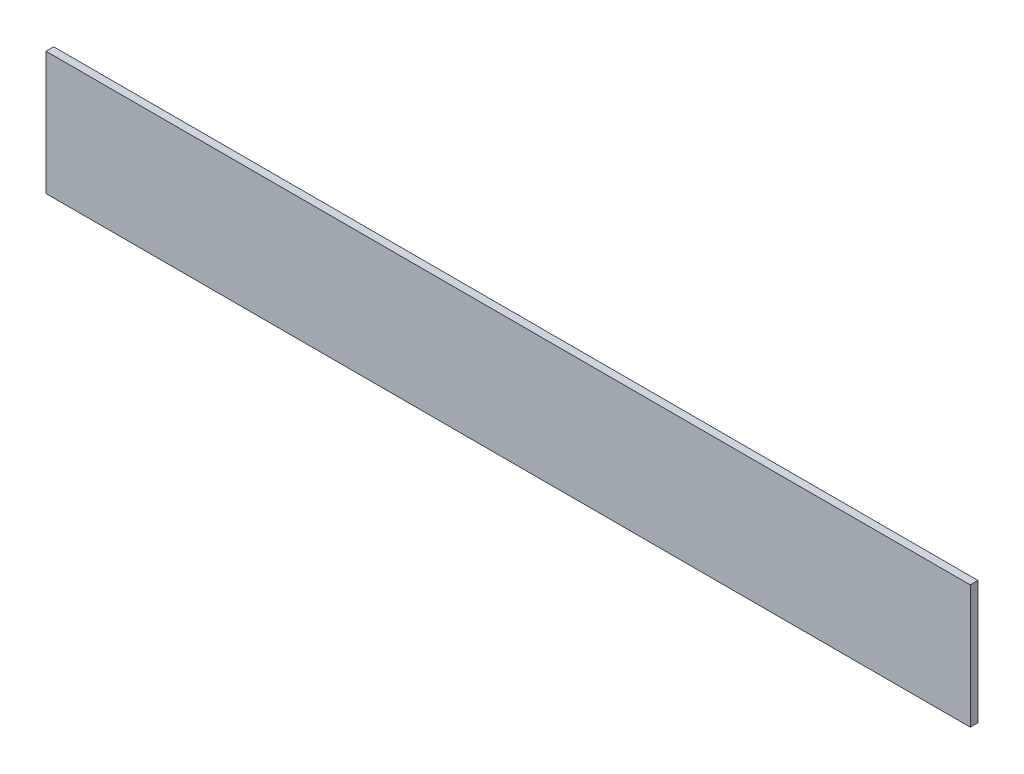
ISO-10303-21;
HEADER;
FILE_DESCRIPTION(('STEP AP214'),'2;1');
FILE_NAME('part.step','',(''),(''),'','','');
FILE_SCHEMA(('AUTOMOTIVE_DESIGN { 1 0 10303 214 1 1 1 1 }'));
ENDSEC;
DATA;
#1=APPLICATION_CONTEXT('core data for automotive mechanical design processes');
#2=APPLICATION_PROTOCOL_DEFINITION('international standard','automotive_design',2000,#1);
#3=PRODUCT_CONTEXT('',#1,'mechanical');
#4=PRODUCT('Part','Part','',(#3));
#5=PRODUCT_RELATED_PRODUCT_CATEGORY('part','',(#4));
#6=PRODUCT_DEFINITION_FORMATION('','',#4);
#7=PRODUCT_DEFINITION_CONTEXT('part definition',#1,'design');
#8=PRODUCT_DEFINITION('design','',#6,#7);
#9=PRODUCT_DEFINITION_SHAPE('','',#8);
#10=(LENGTH_UNIT() NAMED_UNIT(*) SI_UNIT(.MILLI.,.METRE.));
#11=(NAMED_UNIT(*) PLANE_ANGLE_UNIT() SI_UNIT($,.RADIAN.));
#12=(NAMED_UNIT(*) SI_UNIT($,.STERADIAN.) SOLID_ANGLE_UNIT());
#13=UNCERTAINTY_MEASURE_WITH_UNIT(LENGTH_MEASURE(1.E-05),#10,'distance_accuracy_value','');
#14=(GEOMETRIC_REPRESENTATION_CONTEXT(3) GLOBAL_UNCERTAINTY_ASSIGNED_CONTEXT((#13)) GLOBAL_UNIT_ASSIGNED_CONTEXT((#10,
#11,#12)) REPRESENTATION_CONTEXT('',''));
#15=CARTESIAN_POINT('',(0.,0.,0.));
#16=DIRECTION('',(0.,0.,1.));
#17=DIRECTION('',(1.,0.,0.));
#18=AXIS2_PLACEMENT_3D('',#15,#16,#17);
#19=CARTESIAN_POINT('',(0.,0.,3.175));
#20=DIRECTION('',(1.,0.,0.));
#21=DIRECTION('',(0.,0.,-1.));
#22=AXIS2_PLACEMENT_3D('',#19,#20,#21);
#23=PLANE('',#22);
#24=DIRECTION('',(0.,-1.,0.));
#25=VECTOR('',#24,1.);
#26=CARTESIAN_POINT('',(0.,0.,0.));
#27=LINE('',#26,#25);
#28=CARTESIAN_POINT('',(0.,50.8,0.));
#29=VERTEX_POINT('',#28);
#30=CARTESIAN_POINT('',(0.,0.,0.));
#31=VERTEX_POINT('',#30);
#32=EDGE_CURVE('E95',#29,#31,#27,.T.);
#33=ORIENTED_EDGE('',*,*,#32,.T.);
#34=DIRECTION('',(0.,0.,-1.));
#35=VECTOR('',#34,1.);
#36=CARTESIAN_POINT('',(0.,0.,3.175));
#37=LINE('',#36,#35);
#38=CARTESIAN_POINT('',(0.,0.,3.175));
#39=VERTEX_POINT('',#38);
#40=EDGE_CURVE('E11',#39,#31,#37,.T.);
#41=ORIENTED_EDGE('',*,*,#40,.F.);
#42=DIRECTION('',(0.,-1.,0.));
#43=VECTOR('',#42,1.);
#44=CARTESIAN_POINT('',(0.,0.,3.175));
#45=LINE('',#44,#43);
#46=CARTESIAN_POINT('',(0.,50.8,3.175));
#47=VERTEX_POINT('',#46);
#48=EDGE_CURVE('E83',#47,#39,#45,.T.);
#49=ORIENTED_EDGE('',*,*,#48,.F.);
#50=DIRECTION('',(0.,0.,-1.));
#51=VECTOR('',#50,1.);
#52=CARTESIAN_POINT('',(0.,50.8,3.175));
#53=LINE('',#52,#51);
#54=EDGE_CURVE('E91',#47,#29,#53,.T.);
#55=ORIENTED_EDGE('',*,*,#54,.T.);
#56=EDGE_LOOP('',(#33,#41,#49,#55));
#57=FACE_BOUND('',#56,.T.);
#58=ADVANCED_FACE('F32',(#57),#23,.F.);
#59=CARTESIAN_POINT('',(0.,0.,3.175));
#60=DIRECTION('',(0.,1.,0.));
#61=DIRECTION('',(0.,0.,1.));
#62=AXIS2_PLACEMENT_3D('',#59,#60,#61);
#63=PLANE('',#62);
#64=DIRECTION('',(1.,0.,0.));
#65=VECTOR('',#64,1.);
#66=CARTESIAN_POINT('',(0.,0.,0.));
#67=LINE('',#66,#65);
#68=CARTESIAN_POINT('',(381.,0.,0.));
#69=VERTEX_POINT('',#68);
#70=EDGE_CURVE('E87',#31,#69,#67,.T.);
#71=ORIENTED_EDGE('',*,*,#70,.T.);
#72=DIRECTION('',(0.,0.,-1.));
#73=VECTOR('',#72,1.);
#74=CARTESIAN_POINT('',(381.,0.,3.175));
#75=LINE('',#74,#73);
#76=CARTESIAN_POINT('',(381.,0.,3.175));
#77=VERTEX_POINT('',#76);
#78=EDGE_CURVE('E40',#77,#69,#75,.T.);
#79=ORIENTED_EDGE('',*,*,#78,.F.);
#80=DIRECTION('',(1.,0.,0.));
#81=VECTOR('',#80,1.);
#82=CARTESIAN_POINT('',(0.,0.,3.175));
#83=LINE('',#82,#81);
#84=EDGE_CURVE('E78',#39,#77,#83,.T.);
#85=ORIENTED_EDGE('',*,*,#84,.F.);
#86=ORIENTED_EDGE('',*,*,#40,.T.);
#87=EDGE_LOOP('',(#71,#79,#85,#86));
#88=FACE_BOUND('',#87,.T.);
#89=ADVANCED_FACE('F86',(#88),#63,.F.);
#90=CARTESIAN_POINT('',(381.,0.,3.175));
#91=DIRECTION('',(-1.,0.,0.));
#92=DIRECTION('',(0.,0.,1.));
#93=AXIS2_PLACEMENT_3D('',#90,#91,#92);
#94=PLANE('',#93);
#95=DIRECTION('',(0.,1.,0.));
#96=VECTOR('',#95,1.);
#97=CARTESIAN_POINT('',(381.,0.,0.));
#98=LINE('',#97,#96);
#99=CARTESIAN_POINT('',(381.,50.8,0.));
#100=VERTEX_POINT('',#99);
#101=EDGE_CURVE('E65',#69,#100,#98,.T.);
#102=ORIENTED_EDGE('',*,*,#101,.T.);
#103=DIRECTION('',(0.,0.,-1.));
#104=VECTOR('',#103,1.);
#105=CARTESIAN_POINT('',(381.,50.8,3.175));
#106=LINE('',#105,#104);
#107=CARTESIAN_POINT('',(381.,50.8,3.175));
#108=VERTEX_POINT('',#107);
#109=EDGE_CURVE('E88',#108,#100,#106,.T.);
#110=ORIENTED_EDGE('',*,*,#109,.F.);
#111=DIRECTION('',(0.,1.,0.));
#112=VECTOR('',#111,1.);
#113=CARTESIAN_POINT('',(381.,0.,3.175));
#114=LINE('',#113,#112);
#115=EDGE_CURVE('E81',#77,#108,#114,.T.);
#116=ORIENTED_EDGE('',*,*,#115,.F.);
#117=ORIENTED_EDGE('',*,*,#78,.T.);
#118=EDGE_LOOP('',(#102,#110,#116,#117));
#119=FACE_BOUND('',#118,.T.);
#120=ADVANCED_FACE('F89',(#119),#94,.F.);
#121=CARTESIAN_POINT('',(0.,50.8,3.175));
#122=DIRECTION('',(0.,-1.,0.));
#123=DIRECTION('',(0.,0.,-1.));
#124=AXIS2_PLACEMENT_3D('',#121,#122,#123);
#125=PLANE('',#124);
#126=DIRECTION('',(-1.,0.,0.));
#127=VECTOR('',#126,1.);
#128=CARTESIAN_POINT('',(0.,50.8,0.));
#129=LINE('',#128,#127);
#130=EDGE_CURVE('E71',#100,#29,#129,.T.);
#131=ORIENTED_EDGE('',*,*,#130,.T.);
#132=ORIENTED_EDGE('',*,*,#54,.F.);
#133=DIRECTION('',(-1.,0.,0.));
#134=VECTOR('',#133,1.);
#135=CARTESIAN_POINT('',(0.,50.8,3.175));
#136=LINE('',#135,#134);
#137=EDGE_CURVE('E48',#108,#47,#136,.T.);
#138=ORIENTED_EDGE('',*,*,#137,.F.);
#139=ORIENTED_EDGE('',*,*,#109,.T.);
#140=EDGE_LOOP('',(#131,#132,#138,#139));
#141=FACE_BOUND('',#140,.T.);
#142=ADVANCED_FACE('F102',(#141),#125,.F.);
#143=CARTESIAN_POINT('',(0.,0.,3.175));
#144=DIRECTION('',(0.,0.,-1.));
#145=DIRECTION('',(-1.,0.,0.));
#146=AXIS2_PLACEMENT_3D('',#143,#144,#145);
#147=PLANE('',#146);
#148=ORIENTED_EDGE('',*,*,#48,.T.);
#149=ORIENTED_EDGE('',*,*,#84,.T.);
#150=ORIENTED_EDGE('',*,*,#115,.T.);
#151=ORIENTED_EDGE('',*,*,#137,.T.);
#152=EDGE_LOOP('',(#148,#149,#150,#151));
#153=FACE_BOUND('',#152,.T.);
#154=ADVANCED_FACE('F79',(#153),#147,.F.);
#155=CARTESIAN_POINT('',(0.,0.,0.));
#156=DIRECTION('',(0.,0.,-1.));
#157=DIRECTION('',(-1.,0.,0.));
#158=AXIS2_PLACEMENT_3D('',#155,#156,#157);
#159=PLANE('',#158);
#160=ORIENTED_EDGE('',*,*,#32,.F.);
#161=ORIENTED_EDGE('',*,*,#130,.F.);
#162=ORIENTED_EDGE('',*,*,#101,.F.);
#163=ORIENTED_EDGE('',*,*,#70,.F.);
#164=EDGE_LOOP('',(#160,#161,#162,#163));
#165=FACE_BOUND('',#164,.T.);
#166=ADVANCED_FACE('F105',(#165),#159,.T.);
#167=CLOSED_SHELL('',(#58,#89,#120,#142,#154,#166));
#168=MANIFOLD_SOLID_BREP('B2',#167);
#169=ADVANCED_BREP_SHAPE_REPRESENTATION('',(#18,#168),#14);
#170=SHAPE_DEFINITION_REPRESENTATION(#9,#169);
ENDSEC;
END-ISO-10303-21;
